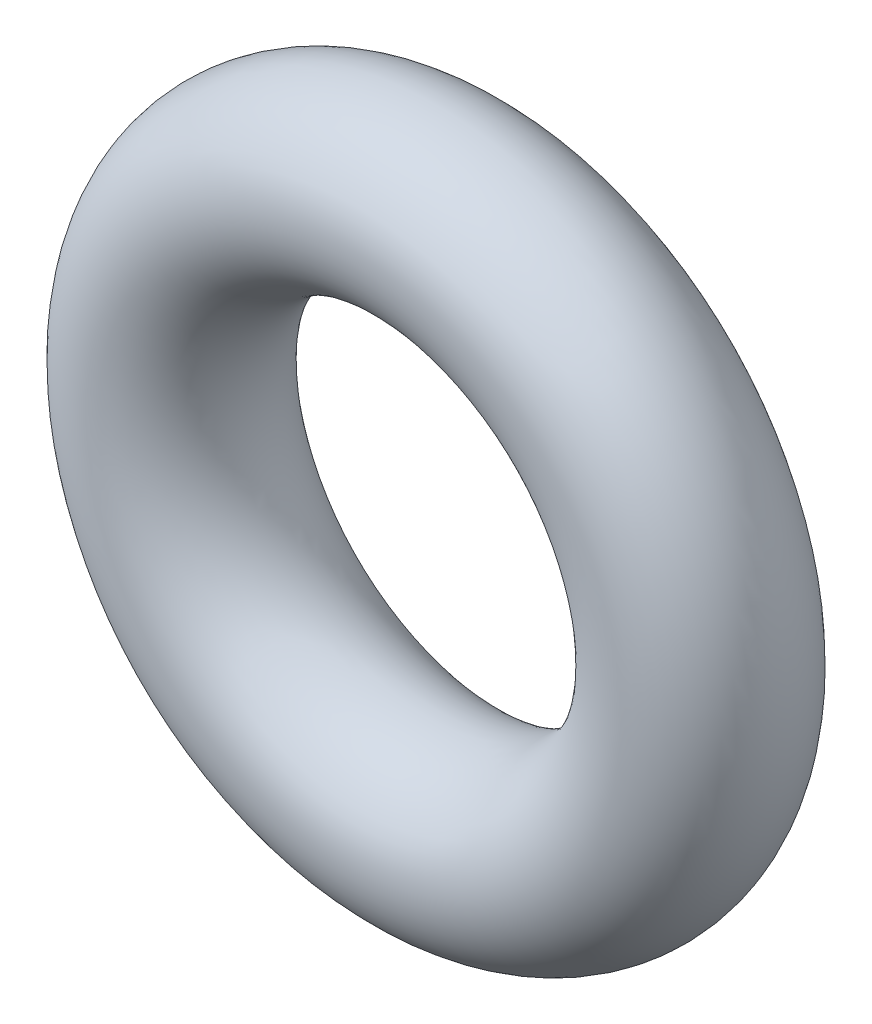
ISO-10303-21;
HEADER;
FILE_DESCRIPTION(('STEP AP214'),'2;1');
FILE_NAME('part.step','',(''),(''),'','','');
FILE_SCHEMA(('AUTOMOTIVE_DESIGN { 1 0 10303 214 1 1 1 1 }'));
ENDSEC;
DATA;
#1=APPLICATION_CONTEXT('core data for automotive mechanical design processes');
#2=APPLICATION_PROTOCOL_DEFINITION('international standard','automotive_design',2000,#1);
#3=PRODUCT_CONTEXT('',#1,'mechanical');
#4=PRODUCT('Part','Part','',(#3));
#5=PRODUCT_RELATED_PRODUCT_CATEGORY('part','',(#4));
#6=PRODUCT_DEFINITION_FORMATION('','',#4);
#7=PRODUCT_DEFINITION_CONTEXT('part definition',#1,'design');
#8=PRODUCT_DEFINITION('design','',#6,#7);
#9=PRODUCT_DEFINITION_SHAPE('','',#8);
#10=(LENGTH_UNIT() NAMED_UNIT(*) SI_UNIT(.MILLI.,.METRE.));
#11=(NAMED_UNIT(*) PLANE_ANGLE_UNIT() SI_UNIT($,.RADIAN.));
#12=(NAMED_UNIT(*) SI_UNIT($,.STERADIAN.) SOLID_ANGLE_UNIT());
#13=UNCERTAINTY_MEASURE_WITH_UNIT(LENGTH_MEASURE(1.E-05),#10,'distance_accuracy_value','');
#14=(GEOMETRIC_REPRESENTATION_CONTEXT(3) GLOBAL_UNCERTAINTY_ASSIGNED_CONTEXT((#13)) GLOBAL_UNIT_ASSIGNED_CONTEXT((#10,
#11,#12)) REPRESENTATION_CONTEXT('',''));
#15=CARTESIAN_POINT('',(0.,0.,0.));
#16=DIRECTION('',(0.,0.,1.));
#17=DIRECTION('',(1.,0.,0.));
#18=AXIS2_PLACEMENT_3D('',#15,#16,#17);
#19=CARTESIAN_POINT('',(0.,0.,0.));
#20=DIRECTION('',(0.,0.,1.));
#21=DIRECTION('',(1.,0.,0.));
#22=AXIS2_PLACEMENT_3D('',#19,#20,#21);
#23=TOROIDAL_SURFACE('',#22,1.5,0.5);
#24=CARTESIAN_POINT('',(2.,0.,0.));
#25=VERTEX_POINT('',#24);
#26=VERTEX_LOOP('',#25);
#27=FACE_BOUND('',#26,.T.);
#28=ADVANCED_FACE('F32',(#27),#23,.T.);
#29=CLOSED_SHELL('',(#28));
#30=MANIFOLD_SOLID_BREP('B2',#29);
#31=ADVANCED_BREP_SHAPE_REPRESENTATION('',(#18,#30),#14);
#32=SHAPE_DEFINITION_REPRESENTATION(#9,#31);
ENDSEC;
END-ISO-10303-21;
